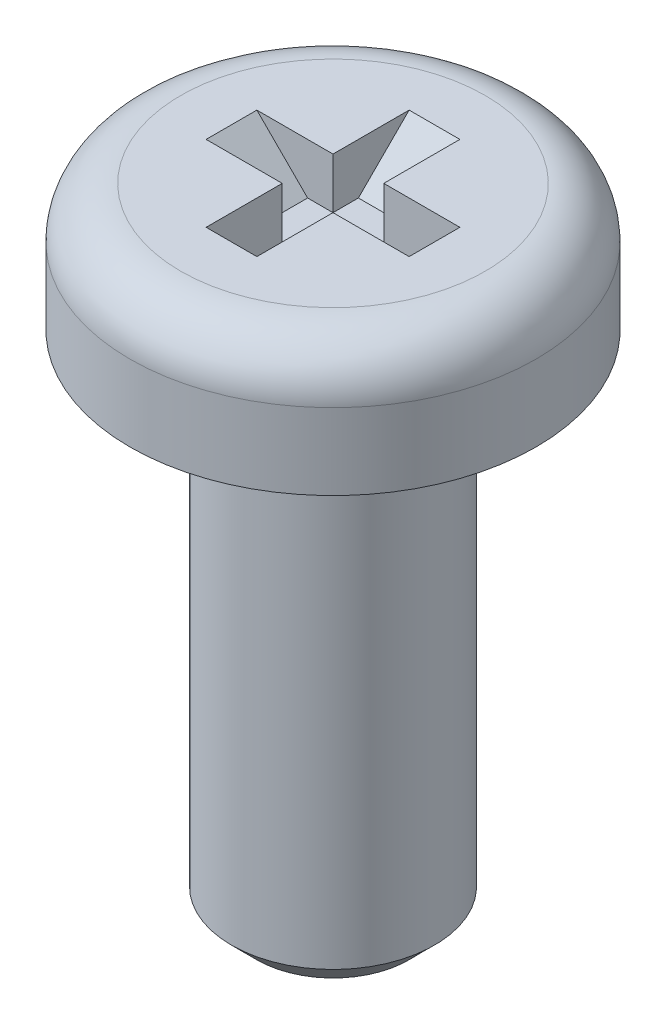
ISO-10303-21;
HEADER;
FILE_DESCRIPTION(('STEP AP214'),'2;1');
FILE_NAME('part.step','',(''),(''),'','','');
FILE_SCHEMA(('AUTOMOTIVE_DESIGN { 1 0 10303 214 1 1 1 1 }'));
ENDSEC;
DATA;
#1=APPLICATION_CONTEXT('core data for automotive mechanical design processes');
#2=APPLICATION_PROTOCOL_DEFINITION('international standard','automotive_design',2000,#1);
#3=PRODUCT_CONTEXT('',#1,'mechanical');
#4=PRODUCT('Part','Part','',(#3));
#5=PRODUCT_RELATED_PRODUCT_CATEGORY('part','',(#4));
#6=PRODUCT_DEFINITION_FORMATION('','',#4);
#7=PRODUCT_DEFINITION_CONTEXT('part definition',#1,'design');
#8=PRODUCT_DEFINITION('design','',#6,#7);
#9=PRODUCT_DEFINITION_SHAPE('','',#8);
#10=(LENGTH_UNIT() NAMED_UNIT(*) SI_UNIT(.MILLI.,.METRE.));
#11=(NAMED_UNIT(*) PLANE_ANGLE_UNIT() SI_UNIT($,.RADIAN.));
#12=(NAMED_UNIT(*) SI_UNIT($,.STERADIAN.) SOLID_ANGLE_UNIT());
#13=UNCERTAINTY_MEASURE_WITH_UNIT(LENGTH_MEASURE(1.E-05),#10,'distance_accuracy_value','');
#14=(GEOMETRIC_REPRESENTATION_CONTEXT(3) GLOBAL_UNCERTAINTY_ASSIGNED_CONTEXT((#13)) GLOBAL_UNIT_ASSIGNED_CONTEXT((#10,
#11,#12)) REPRESENTATION_CONTEXT('',''));
#15=CARTESIAN_POINT('',(0.,0.,0.));
#16=DIRECTION('',(0.,0.,1.));
#17=DIRECTION('',(1.,0.,0.));
#18=AXIS2_PLACEMENT_3D('',#15,#16,#17);
#19=CARTESIAN_POINT('',(0.,10.,0.));
#20=DIRECTION('',(0.,-1.,0.));
#21=DIRECTION('',(0.,0.,-1.));
#22=AXIS2_PLACEMENT_3D('',#19,#20,#21);
#23=CYLINDRICAL_SURFACE('',#22,2.);
#24=CARTESIAN_POINT('',(0.,0.5,0.));
#25=DIRECTION('',(0.,1.,0.));
#26=DIRECTION('',(0.,0.,1.));
#27=AXIS2_PLACEMENT_3D('',#24,#25,#26);
#28=CIRCLE('',#27,2.);
#29=CARTESIAN_POINT('',(0.,0.5,2.));
#30=VERTEX_POINT('',#29);
#31=EDGE_CURVE('E245',#30,#30,#28,.T.);
#32=ORIENTED_EDGE('',*,*,#31,.T.);
#33=EDGE_LOOP('',(#32));
#34=FACE_BOUND('',#33,.T.);
#35=CARTESIAN_POINT('',(0.,10.,0.));
#36=DIRECTION('',(0.,1.,0.));
#37=DIRECTION('',(0.,0.,1.));
#38=AXIS2_PLACEMENT_3D('',#35,#36,#37);
#39=CIRCLE('',#38,2.);
#40=CARTESIAN_POINT('',(0.,10.,2.));
#41=VERTEX_POINT('',#40);
#42=EDGE_CURVE('E231',#41,#41,#39,.T.);
#43=ORIENTED_EDGE('',*,*,#42,.F.);
#44=EDGE_LOOP('',(#43));
#45=FACE_BOUND('',#44,.T.);
#46=ADVANCED_FACE('F66',(#34,#45),#23,.T.);
#47=CARTESIAN_POINT('',(0.,0.,0.));
#48=DIRECTION('',(0.,1.,0.));
#49=DIRECTION('',(0.,0.,1.));
#50=AXIS2_PLACEMENT_3D('',#47,#48,#49);
#51=PLANE('',#50);
#52=CARTESIAN_POINT('',(0.,0.,0.));
#53=DIRECTION('',(0.,1.,0.));
#54=DIRECTION('',(0.,0.,1.));
#55=AXIS2_PLACEMENT_3D('',#52,#53,#54);
#56=CIRCLE('',#55,1.5);
#57=CARTESIAN_POINT('',(0.,0.,1.5));
#58=VERTEX_POINT('',#57);
#59=EDGE_CURVE('E244',#58,#58,#56,.F.);
#60=ORIENTED_EDGE('',*,*,#59,.T.);
#61=EDGE_LOOP('',(#60));
#62=FACE_BOUND('',#61,.T.);
#63=ADVANCED_FACE('F309',(#62),#51,.F.);
#64=CARTESIAN_POINT('',(0.,12.5,0.));
#65=DIRECTION('',(0.,-1.,0.));
#66=DIRECTION('',(0.,0.,-1.));
#67=AXIS2_PLACEMENT_3D('',#64,#65,#66);
#68=CYLINDRICAL_SURFACE('',#67,4.);
#69=CARTESIAN_POINT('',(0.,11.5,0.));
#70=DIRECTION('',(0.,1.,0.));
#71=DIRECTION('',(0.,0.,1.));
#72=AXIS2_PLACEMENT_3D('',#69,#70,#71);
#73=CIRCLE('',#72,4.);
#74=CARTESIAN_POINT('',(0.,11.5,4.));
#75=VERTEX_POINT('',#74);
#76=EDGE_CURVE('E237',#75,#75,#73,.F.);
#77=ORIENTED_EDGE('',*,*,#76,.T.);
#78=EDGE_LOOP('',(#77));
#79=FACE_BOUND('',#78,.T.);
#80=CARTESIAN_POINT('',(0.,10.,0.));
#81=DIRECTION('',(0.,1.,0.));
#82=DIRECTION('',(0.,0.,1.));
#83=AXIS2_PLACEMENT_3D('',#80,#81,#82);
#84=CIRCLE('',#83,4.);
#85=CARTESIAN_POINT('',(0.,10.,4.));
#86=VERTEX_POINT('',#85);
#87=EDGE_CURVE('E219',#86,#86,#84,.T.);
#88=ORIENTED_EDGE('',*,*,#87,.T.);
#89=EDGE_LOOP('',(#88));
#90=FACE_BOUND('',#89,.T.);
#91=ADVANCED_FACE('F317',(#79,#90),#68,.T.);
#92=CARTESIAN_POINT('',(0.,12.5,0.));
#93=DIRECTION('',(0.,1.,0.));
#94=DIRECTION('',(0.,0.,1.));
#95=AXIS2_PLACEMENT_3D('',#92,#93,#94);
#96=PLANE('',#95);
#97=DIRECTION('',(0.,0.,-1.));
#98=VECTOR('',#97,1.);
#99=CARTESIAN_POINT('',(-0.5,12.5,-2.));
#100=LINE('',#99,#98);
#101=CARTESIAN_POINT('',(-0.5,12.5,-2.));
#102=VERTEX_POINT('',#101);
#103=CARTESIAN_POINT('',(-0.5,12.5,-0.5));
#104=VERTEX_POINT('',#103);
#105=EDGE_CURVE('E190',#102,#104,#100,.F.);
#106=ORIENTED_EDGE('',*,*,#105,.F.);
#107=DIRECTION('',(1.,0.,0.));
#108=VECTOR('',#107,1.);
#109=CARTESIAN_POINT('',(-0.5,12.5,-2.));
#110=LINE('',#109,#108);
#111=CARTESIAN_POINT('',(0.5,12.5,-2.));
#112=VERTEX_POINT('',#111);
#113=EDGE_CURVE('E193',#102,#112,#110,.T.);
#114=ORIENTED_EDGE('',*,*,#113,.T.);
#115=DIRECTION('',(0.,0.,-1.));
#116=VECTOR('',#115,1.);
#117=CARTESIAN_POINT('',(0.5,12.5,-2.));
#118=LINE('',#117,#116);
#119=CARTESIAN_POINT('',(0.5,12.5,-0.5));
#120=VERTEX_POINT('',#119);
#121=EDGE_CURVE('E185',#112,#120,#118,.F.);
#122=ORIENTED_EDGE('',*,*,#121,.T.);
#123=DIRECTION('',(1.,0.,0.));
#124=VECTOR('',#123,1.);
#125=CARTESIAN_POINT('',(-2.,12.5,-0.5));
#126=LINE('',#125,#124);
#127=CARTESIAN_POINT('',(2.,12.5,-0.500000000000001));
#128=VERTEX_POINT('',#127);
#129=EDGE_CURVE('E223',#120,#128,#126,.T.);
#130=ORIENTED_EDGE('',*,*,#129,.T.);
#131=DIRECTION('',(0.,0.,1.));
#132=VECTOR('',#131,1.);
#133=CARTESIAN_POINT('',(2.,12.5,-0.500000000000001));
#134=LINE('',#133,#132);
#135=CARTESIAN_POINT('',(2.,12.5,0.499999999999999));
#136=VERTEX_POINT('',#135);
#137=EDGE_CURVE('E221',#128,#136,#134,.T.);
#138=ORIENTED_EDGE('',*,*,#137,.T.);
#139=DIRECTION('',(1.,0.,0.));
#140=VECTOR('',#139,1.);
#141=CARTESIAN_POINT('',(-2.,12.5,0.5));
#142=LINE('',#141,#140);
#143=CARTESIAN_POINT('',(0.5,12.5,0.5));
#144=VERTEX_POINT('',#143);
#145=EDGE_CURVE('E181',#144,#136,#142,.T.);
#146=ORIENTED_EDGE('',*,*,#145,.F.);
#147=CARTESIAN_POINT('',(0.5,12.5,2.));
#148=VERTEX_POINT('',#147);
#149=EDGE_CURVE('E162',#144,#148,#118,.F.);
#150=ORIENTED_EDGE('',*,*,#149,.T.);
#151=DIRECTION('',(-1.,0.,0.));
#152=VECTOR('',#151,1.);
#153=CARTESIAN_POINT('',(0.5,12.5,2.));
#154=LINE('',#153,#152);
#155=CARTESIAN_POINT('',(-0.5,12.5,2.));
#156=VERTEX_POINT('',#155);
#157=EDGE_CURVE('E178',#148,#156,#154,.T.);
#158=ORIENTED_EDGE('',*,*,#157,.T.);
#159=CARTESIAN_POINT('',(-0.5,12.5,0.5));
#160=VERTEX_POINT('',#159);
#161=EDGE_CURVE('E188',#160,#156,#100,.F.);
#162=ORIENTED_EDGE('',*,*,#161,.F.);
#163=CARTESIAN_POINT('',(-2.,12.5,0.5));
#164=VERTEX_POINT('',#163);
#165=EDGE_CURVE('E216',#164,#160,#142,.T.);
#166=ORIENTED_EDGE('',*,*,#165,.F.);
#167=DIRECTION('',(0.,0.,-1.));
#168=VECTOR('',#167,1.);
#169=CARTESIAN_POINT('',(-2.,12.5,0.5));
#170=LINE('',#169,#168);
#171=CARTESIAN_POINT('',(-2.,12.5,-0.5));
#172=VERTEX_POINT('',#171);
#173=EDGE_CURVE('E226',#164,#172,#170,.T.);
#174=ORIENTED_EDGE('',*,*,#173,.T.);
#175=EDGE_CURVE('E222',#172,#104,#126,.T.);
#176=ORIENTED_EDGE('',*,*,#175,.T.);
#177=EDGE_LOOP('',(#106,#114,#122,#130,#138,#146,#150,#158,#162,#166,#174,#176));
#178=FACE_BOUND('',#177,.T.);
#179=CARTESIAN_POINT('',(0.,12.5,0.));
#180=DIRECTION('',(0.,1.,0.));
#181=DIRECTION('',(0.,0.,1.));
#182=AXIS2_PLACEMENT_3D('',#179,#180,#181);
#183=CIRCLE('',#182,3.);
#184=CARTESIAN_POINT('',(0.,12.5,3.));
#185=VERTEX_POINT('',#184);
#186=EDGE_CURVE('E236',#185,#185,#183,.T.);
#187=ORIENTED_EDGE('',*,*,#186,.T.);
#188=EDGE_LOOP('',(#187));
#189=FACE_BOUND('',#188,.T.);
#190=ADVANCED_FACE('F174',(#178,#189),#96,.T.);
#191=CARTESIAN_POINT('',(0.,10.,0.));
#192=DIRECTION('',(0.,1.,0.));
#193=DIRECTION('',(0.,0.,1.));
#194=AXIS2_PLACEMENT_3D('',#191,#192,#193);
#195=PLANE('',#194);
#196=ORIENTED_EDGE('',*,*,#42,.T.);
#197=EDGE_LOOP('',(#196));
#198=FACE_BOUND('',#197,.T.);
#199=ORIENTED_EDGE('',*,*,#87,.F.);
#200=EDGE_LOOP('',(#199));
#201=FACE_BOUND('',#200,.T.);
#202=ADVANCED_FACE('F324',(#198,#201),#195,.F.);
#203=CARTESIAN_POINT('',(0.,11.5,0.));
#204=DIRECTION('',(0.,1.,0.));
#205=DIRECTION('',(0.,0.,1.));
#206=AXIS2_PLACEMENT_3D('',#203,#204,#205);
#207=TOROIDAL_SURFACE('',#206,3.,1.);
#208=ORIENTED_EDGE('',*,*,#76,.F.);
#209=EDGE_LOOP('',(#208));
#210=FACE_BOUND('',#209,.T.);
#211=ORIENTED_EDGE('',*,*,#186,.F.);
#212=EDGE_LOOP('',(#211));
#213=FACE_BOUND('',#212,.T.);
#214=ADVANCED_FACE('F302',(#210,#213),#207,.T.);
#215=CARTESIAN_POINT('',(0.,0.5,0.));
#216=DIRECTION('',(0.,1.,0.));
#217=DIRECTION('',(0.,0.,1.));
#218=AXIS2_PLACEMENT_3D('',#215,#216,#217);
#219=CONICAL_SURFACE('',#218,2.,0.78539816339745);
#220=ORIENTED_EDGE('',*,*,#59,.F.);
#221=EDGE_LOOP('',(#220));
#222=FACE_BOUND('',#221,.T.);
#223=ORIENTED_EDGE('',*,*,#31,.F.);
#224=EDGE_LOOP('',(#223));
#225=FACE_BOUND('',#224,.T.);
#226=ADVANCED_FACE('F298',(#222,#225),#219,.T.);
#227=CARTESIAN_POINT('',(-2.,11.5,0.5));
#228=DIRECTION('',(0.,0.,1.));
#229=DIRECTION('',(1.,0.,0.));
#230=AXIS2_PLACEMENT_3D('',#227,#228,#229);
#231=PLANE('',#230);
#232=ORIENTED_EDGE('',*,*,#145,.T.);
#233=DIRECTION('',(-0.707106781186544,-0.707106781186551,0.));
#234=VECTOR('',#233,1.);
#235=CARTESIAN_POINT('',(2.,12.5,0.499999999999999));
#236=LINE('',#235,#234);
#237=CARTESIAN_POINT('',(1.00000000000001,11.5,0.5));
#238=VERTEX_POINT('',#237);
#239=EDGE_CURVE('E166',#136,#238,#236,.T.);
#240=ORIENTED_EDGE('',*,*,#239,.T.);
#241=DIRECTION('',(1.,0.,0.));
#242=VECTOR('',#241,1.);
#243=CARTESIAN_POINT('',(-2.,11.5,0.5));
#244=LINE('',#243,#242);
#245=CARTESIAN_POINT('',(0.5,11.5,0.5));
#246=VERTEX_POINT('',#245);
#247=EDGE_CURVE('E211',#246,#238,#244,.T.);
#248=ORIENTED_EDGE('',*,*,#247,.F.);
#249=DIRECTION('',(0.,-1.,0.));
#250=VECTOR('',#249,1.);
#251=CARTESIAN_POINT('',(0.5,11.5,0.5));
#252=LINE('',#251,#250);
#253=EDGE_CURVE('E201',#144,#246,#252,.T.);
#254=ORIENTED_EDGE('',*,*,#253,.F.);
#255=EDGE_LOOP('',(#232,#240,#248,#254));
#256=FACE_BOUND('',#255,.T.);
#257=ADVANCED_FACE('F295',(#256),#231,.F.);
#258=CARTESIAN_POINT('',(-2.,11.5,-0.5));
#259=DIRECTION('',(0.,0.,1.));
#260=DIRECTION('',(1.,0.,0.));
#261=AXIS2_PLACEMENT_3D('',#258,#259,#260);
#262=PLANE('',#261);
#263=DIRECTION('',(1.,0.,0.));
#264=VECTOR('',#263,1.);
#265=CARTESIAN_POINT('',(-2.,11.5,-0.5));
#266=LINE('',#265,#264);
#267=CARTESIAN_POINT('',(0.5,11.5,-0.5));
#268=VERTEX_POINT('',#267);
#269=CARTESIAN_POINT('',(1.00000000000001,11.5,-0.5));
#270=VERTEX_POINT('',#269);
#271=EDGE_CURVE('E214',#268,#270,#266,.T.);
#272=ORIENTED_EDGE('',*,*,#271,.T.);
#273=DIRECTION('',(0.707106781186544,0.707106781186551,0.));
#274=VECTOR('',#273,1.);
#275=CARTESIAN_POINT('',(-0.499999999999981,10.,-0.5));
#276=LINE('',#275,#274);
#277=EDGE_CURVE('E257',#270,#128,#276,.T.);
#278=ORIENTED_EDGE('',*,*,#277,.T.);
#279=ORIENTED_EDGE('',*,*,#129,.F.);
#280=DIRECTION('',(0.,-1.,0.));
#281=VECTOR('',#280,1.);
#282=CARTESIAN_POINT('',(0.5,11.5,-0.5));
#283=LINE('',#282,#281);
#284=EDGE_CURVE('E196',#120,#268,#283,.T.);
#285=ORIENTED_EDGE('',*,*,#284,.T.);
#286=EDGE_LOOP('',(#272,#278,#279,#285));
#287=FACE_BOUND('',#286,.T.);
#288=ADVANCED_FACE('F286',(#287),#262,.T.);
#289=CARTESIAN_POINT('',(-1.00000000000001,11.5,0.5));
#290=VERTEX_POINT('',#289);
#291=CARTESIAN_POINT('',(-0.5,11.5,0.5));
#292=VERTEX_POINT('',#291);
#293=EDGE_CURVE('E212',#290,#292,#244,.T.);
#294=ORIENTED_EDGE('',*,*,#293,.F.);
#295=DIRECTION('',(-0.707106781186544,0.707106781186551,0.));
#296=VECTOR('',#295,1.);
#297=CARTESIAN_POINT('',(-2.,12.5,0.5));
#298=LINE('',#297,#296);
#299=EDGE_CURVE('E12',#290,#164,#298,.T.);
#300=ORIENTED_EDGE('',*,*,#299,.T.);
#301=ORIENTED_EDGE('',*,*,#165,.T.);
#302=DIRECTION('',(0.,-1.,0.));
#303=VECTOR('',#302,1.);
#304=CARTESIAN_POINT('',(-0.5,11.5,0.5));
#305=LINE('',#304,#303);
#306=EDGE_CURVE('E206',#160,#292,#305,.T.);
#307=ORIENTED_EDGE('',*,*,#306,.T.);
#308=EDGE_LOOP('',(#294,#300,#301,#307));
#309=FACE_BOUND('',#308,.T.);
#310=ADVANCED_FACE('F274',(#309),#231,.F.);
#311=ORIENTED_EDGE('',*,*,#175,.F.);
#312=DIRECTION('',(0.707106781186544,-0.707106781186551,0.));
#313=VECTOR('',#312,1.);
#314=CARTESIAN_POINT('',(-1.5,12.,-0.5));
#315=LINE('',#314,#313);
#316=CARTESIAN_POINT('',(-1.00000000000001,11.5,-0.5));
#317=VERTEX_POINT('',#316);
#318=EDGE_CURVE('E76',#172,#317,#315,.T.);
#319=ORIENTED_EDGE('',*,*,#318,.T.);
#320=CARTESIAN_POINT('',(-0.5,11.5,-0.5));
#321=VERTEX_POINT('',#320);
#322=EDGE_CURVE('E213',#317,#321,#266,.T.);
#323=ORIENTED_EDGE('',*,*,#322,.T.);
#324=DIRECTION('',(0.,-1.,0.));
#325=VECTOR('',#324,1.);
#326=CARTESIAN_POINT('',(-0.5,11.5,-0.5));
#327=LINE('',#326,#325);
#328=EDGE_CURVE('E202',#104,#321,#327,.T.);
#329=ORIENTED_EDGE('',*,*,#328,.F.);
#330=EDGE_LOOP('',(#311,#319,#323,#329));
#331=FACE_BOUND('',#330,.T.);
#332=ADVANCED_FACE('F264',(#331),#262,.T.);
#333=CARTESIAN_POINT('',(0.,11.5,0.));
#334=DIRECTION('',(0.,-1.,0.));
#335=DIRECTION('',(-1.,0.,0.));
#336=AXIS2_PLACEMENT_3D('',#333,#334,#335);
#337=PLANE('',#336);
#338=DIRECTION('',(0.,0.,-1.));
#339=VECTOR('',#338,1.);
#340=CARTESIAN_POINT('',(-0.5,11.5,-2.));
#341=LINE('',#340,#339);
#342=CARTESIAN_POINT('',(-0.5,11.5,1.00000000000001));
#343=VERTEX_POINT('',#342);
#344=EDGE_CURVE('E199',#292,#343,#341,.F.);
#345=ORIENTED_EDGE('',*,*,#344,.T.);
#346=DIRECTION('',(1.,0.,0.));
#347=VECTOR('',#346,1.);
#348=CARTESIAN_POINT('',(0.,11.5,1.00000000000001));
#349=LINE('',#348,#347);
#350=CARTESIAN_POINT('',(0.5,11.5,1.00000000000001));
#351=VERTEX_POINT('',#350);
#352=EDGE_CURVE('E169',#343,#351,#349,.T.);
#353=ORIENTED_EDGE('',*,*,#352,.T.);
#354=DIRECTION('',(0.,0.,-1.));
#355=VECTOR('',#354,1.);
#356=CARTESIAN_POINT('',(0.5,11.5,-2.));
#357=LINE('',#356,#355);
#358=EDGE_CURVE('E165',#246,#351,#357,.F.);
#359=ORIENTED_EDGE('',*,*,#358,.F.);
#360=ORIENTED_EDGE('',*,*,#247,.T.);
#361=DIRECTION('',(0.,0.,-1.));
#362=VECTOR('',#361,1.);
#363=CARTESIAN_POINT('',(1.00000000000001,11.5,0.));
#364=LINE('',#363,#362);
#365=EDGE_CURVE('E255',#238,#270,#364,.T.);
#366=ORIENTED_EDGE('',*,*,#365,.T.);
#367=ORIENTED_EDGE('',*,*,#271,.F.);
#368=CARTESIAN_POINT('',(0.5,11.5,-1.00000000000001));
#369=VERTEX_POINT('',#368);
#370=EDGE_CURVE('E205',#369,#268,#357,.F.);
#371=ORIENTED_EDGE('',*,*,#370,.F.);
#372=DIRECTION('',(-1.,0.,0.));
#373=VECTOR('',#372,1.);
#374=CARTESIAN_POINT('',(0.,11.5,-1.00000000000001));
#375=LINE('',#374,#373);
#376=CARTESIAN_POINT('',(-0.5,11.5,-1.00000000000001));
#377=VERTEX_POINT('',#376);
#378=EDGE_CURVE('E83',#369,#377,#375,.T.);
#379=ORIENTED_EDGE('',*,*,#378,.T.);
#380=EDGE_CURVE('E267',#377,#321,#341,.F.);
#381=ORIENTED_EDGE('',*,*,#380,.T.);
#382=ORIENTED_EDGE('',*,*,#322,.F.);
#383=DIRECTION('',(0.,0.,1.));
#384=VECTOR('',#383,1.);
#385=CARTESIAN_POINT('',(-1.00000000000001,11.5,0.));
#386=LINE('',#385,#384);
#387=EDGE_CURVE('E248',#317,#290,#386,.T.);
#388=ORIENTED_EDGE('',*,*,#387,.T.);
#389=ORIENTED_EDGE('',*,*,#293,.T.);
#390=EDGE_LOOP('',(#345,#353,#359,#360,#366,#367,#371,#379,#381,#382,#388,#389));
#391=FACE_BOUND('',#390,.T.);
#392=ADVANCED_FACE('F270',(#391),#337,.F.);
#393=CARTESIAN_POINT('',(0.5,11.5,-2.));
#394=DIRECTION('',(-1.,0.,0.));
#395=DIRECTION('',(0.,0.,1.));
#396=AXIS2_PLACEMENT_3D('',#393,#394,#395);
#397=PLANE('',#396);
#398=ORIENTED_EDGE('',*,*,#121,.F.);
#399=DIRECTION('',(0.,-0.707106781186551,0.707106781186544));
#400=VECTOR('',#399,1.);
#401=CARTESIAN_POINT('',(0.5,12.,-1.5));
#402=LINE('',#401,#400);
#403=EDGE_CURVE('E95',#112,#369,#402,.T.);
#404=ORIENTED_EDGE('',*,*,#403,.T.);
#405=ORIENTED_EDGE('',*,*,#370,.T.);
#406=ORIENTED_EDGE('',*,*,#284,.F.);
#407=EDGE_LOOP('',(#398,#404,#405,#406));
#408=FACE_BOUND('',#407,.T.);
#409=ADVANCED_FACE('F282',(#408),#397,.T.);
#410=CARTESIAN_POINT('',(-0.5,11.5,-2.));
#411=DIRECTION('',(-1.,0.,0.));
#412=DIRECTION('',(0.,0.,1.));
#413=AXIS2_PLACEMENT_3D('',#410,#411,#412);
#414=PLANE('',#413);
#415=ORIENTED_EDGE('',*,*,#380,.F.);
#416=DIRECTION('',(0.,0.707106781186551,-0.707106781186544));
#417=VECTOR('',#416,1.);
#418=CARTESIAN_POINT('',(-0.5,12.5,-2.));
#419=LINE('',#418,#417);
#420=EDGE_CURVE('E256',#377,#102,#419,.T.);
#421=ORIENTED_EDGE('',*,*,#420,.T.);
#422=ORIENTED_EDGE('',*,*,#105,.T.);
#423=ORIENTED_EDGE('',*,*,#328,.T.);
#424=EDGE_LOOP('',(#415,#421,#422,#423));
#425=FACE_BOUND('',#424,.T.);
#426=ADVANCED_FACE('F348',(#425),#414,.F.);
#427=ORIENTED_EDGE('',*,*,#161,.T.);
#428=DIRECTION('',(0.,-0.707106781186551,-0.707106781186544));
#429=VECTOR('',#428,1.);
#430=CARTESIAN_POINT('',(-0.5,12.5,2.));
#431=LINE('',#430,#429);
#432=EDGE_CURVE('E184',#156,#343,#431,.T.);
#433=ORIENTED_EDGE('',*,*,#432,.T.);
#434=ORIENTED_EDGE('',*,*,#344,.F.);
#435=ORIENTED_EDGE('',*,*,#306,.F.);
#436=EDGE_LOOP('',(#427,#433,#434,#435));
#437=FACE_BOUND('',#436,.T.);
#438=ADVANCED_FACE('F277',(#437),#414,.F.);
#439=ORIENTED_EDGE('',*,*,#358,.T.);
#440=DIRECTION('',(0.,0.707106781186551,0.707106781186544));
#441=VECTOR('',#440,1.);
#442=CARTESIAN_POINT('',(0.5,10.,-0.499999999999981));
#443=LINE('',#442,#441);
#444=EDGE_CURVE('E160',#351,#148,#443,.T.);
#445=ORIENTED_EDGE('',*,*,#444,.T.);
#446=ORIENTED_EDGE('',*,*,#149,.F.);
#447=ORIENTED_EDGE('',*,*,#253,.T.);
#448=EDGE_LOOP('',(#439,#445,#446,#447));
#449=FACE_BOUND('',#448,.T.);
#450=ADVANCED_FACE('F157',(#449),#397,.T.);
#451=CARTESIAN_POINT('',(0.5,12.5,2.));
#452=DIRECTION('',(0.,-0.707106781186544,0.707106781186551));
#453=DIRECTION('',(-1.,0.,0.));
#454=AXIS2_PLACEMENT_3D('',#451,#452,#453);
#455=PLANE('',#454);
#456=ORIENTED_EDGE('',*,*,#444,.F.);
#457=ORIENTED_EDGE('',*,*,#352,.F.);
#458=ORIENTED_EDGE('',*,*,#432,.F.);
#459=ORIENTED_EDGE('',*,*,#157,.F.);
#460=EDGE_LOOP('',(#456,#457,#458,#459));
#461=FACE_BOUND('',#460,.T.);
#462=ADVANCED_FACE('F183',(#461),#455,.F.);
#463=CARTESIAN_POINT('',(2.,12.5,-0.500000000000001));
#464=DIRECTION('',(0.707106781186551,-0.707106781186544,0.));
#465=DIRECTION('',(0.,0.,1.));
#466=AXIS2_PLACEMENT_3D('',#463,#464,#465);
#467=PLANE('',#466);
#468=ORIENTED_EDGE('',*,*,#277,.F.);
#469=ORIENTED_EDGE('',*,*,#365,.F.);
#470=ORIENTED_EDGE('',*,*,#239,.F.);
#471=ORIENTED_EDGE('',*,*,#137,.F.);
#472=EDGE_LOOP('',(#468,#469,#470,#471));
#473=FACE_BOUND('',#472,.T.);
#474=ADVANCED_FACE('F293',(#473),#467,.F.);
#475=CARTESIAN_POINT('',(-0.5,12.5,-2.));
#476=DIRECTION('',(0.,-0.707106781186544,-0.707106781186551));
#477=DIRECTION('',(1.,0.,0.));
#478=AXIS2_PLACEMENT_3D('',#475,#476,#477);
#479=PLANE('',#478);
#480=ORIENTED_EDGE('',*,*,#420,.F.);
#481=ORIENTED_EDGE('',*,*,#378,.F.);
#482=ORIENTED_EDGE('',*,*,#403,.F.);
#483=ORIENTED_EDGE('',*,*,#113,.F.);
#484=EDGE_LOOP('',(#480,#481,#482,#483));
#485=FACE_BOUND('',#484,.T.);
#486=ADVANCED_FACE('F339',(#485),#479,.F.);
#487=CARTESIAN_POINT('',(-2.,12.5,0.5));
#488=DIRECTION('',(-0.707106781186551,-0.707106781186544,0.));
#489=DIRECTION('',(0.,0.,-1.));
#490=AXIS2_PLACEMENT_3D('',#487,#488,#489);
#491=PLANE('',#490);
#492=ORIENTED_EDGE('',*,*,#299,.F.);
#493=ORIENTED_EDGE('',*,*,#387,.F.);
#494=ORIENTED_EDGE('',*,*,#318,.F.);
#495=ORIENTED_EDGE('',*,*,#173,.F.);
#496=EDGE_LOOP('',(#492,#493,#494,#495));
#497=FACE_BOUND('',#496,.T.);
#498=ADVANCED_FACE('F71',(#497),#491,.F.);
#499=CLOSED_SHELL('',(#46,#63,#91,#190,#202,#214,#226,#257,#288,#310,#332,#392,#409,#426,#438,
#450,#462,#474,#486,#498));
#500=MANIFOLD_SOLID_BREP('B2',#499);
#501=ADVANCED_BREP_SHAPE_REPRESENTATION('',(#18,#500),#14);
#502=SHAPE_DEFINITION_REPRESENTATION(#9,#501);
ENDSEC;
END-ISO-10303-21;
